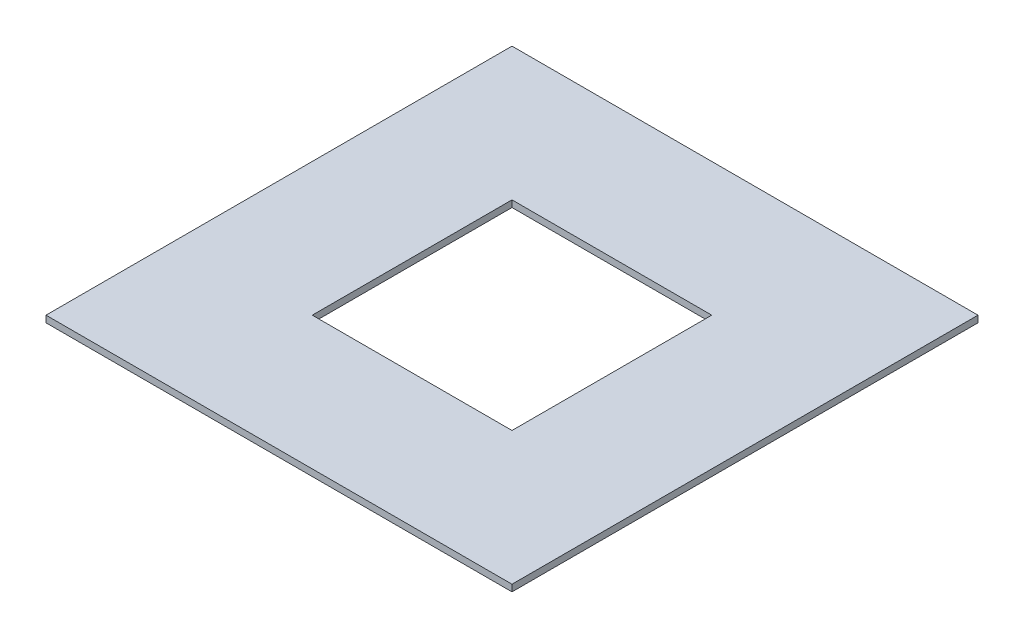
ISO-10303-21;
HEADER;
FILE_DESCRIPTION(('STEP AP214'),'2;1');
FILE_NAME('part.step','',(''),(''),'','','');
FILE_SCHEMA(('AUTOMOTIVE_DESIGN { 1 0 10303 214 1 1 1 1 }'));
ENDSEC;
DATA;
#1=APPLICATION_CONTEXT('core data for automotive mechanical design processes');
#2=APPLICATION_PROTOCOL_DEFINITION('international standard','automotive_design',2000,#1);
#3=PRODUCT_CONTEXT('',#1,'mechanical');
#4=PRODUCT('Part','Part','',(#3));
#5=PRODUCT_RELATED_PRODUCT_CATEGORY('part','',(#4));
#6=PRODUCT_DEFINITION_FORMATION('','',#4);
#7=PRODUCT_DEFINITION_CONTEXT('part definition',#1,'design');
#8=PRODUCT_DEFINITION('design','',#6,#7);
#9=PRODUCT_DEFINITION_SHAPE('','',#8);
#10=(LENGTH_UNIT() NAMED_UNIT(*) SI_UNIT(.MILLI.,.METRE.));
#11=(NAMED_UNIT(*) PLANE_ANGLE_UNIT() SI_UNIT($,.RADIAN.));
#12=(NAMED_UNIT(*) SI_UNIT($,.STERADIAN.) SOLID_ANGLE_UNIT());
#13=UNCERTAINTY_MEASURE_WITH_UNIT(LENGTH_MEASURE(1.E-05),#10,'distance_accuracy_value','');
#14=(GEOMETRIC_REPRESENTATION_CONTEXT(3) GLOBAL_UNCERTAINTY_ASSIGNED_CONTEXT((#13)) GLOBAL_UNIT_ASSIGNED_CONTEXT((#10,
#11,#12)) REPRESENTATION_CONTEXT('',''));
#15=CARTESIAN_POINT('',(0.,0.,0.));
#16=DIRECTION('',(0.,0.,1.));
#17=DIRECTION('',(1.,0.,0.));
#18=AXIS2_PLACEMENT_3D('',#15,#16,#17);
#19=CARTESIAN_POINT('',(-100.648126232742,-2.54,61.8968441814596));
#20=DIRECTION('',(0.,0.,1.));
#21=DIRECTION('',(1.,0.,0.));
#22=AXIS2_PLACEMENT_3D('',#19,#20,#21);
#23=PLANE('',#22);
#24=DIRECTION('',(1.,0.,0.));
#25=VECTOR('',#24,1.);
#26=CARTESIAN_POINT('',(-100.648126232742,0.,61.8968441814596));
#27=LINE('',#26,#25);
#28=CARTESIAN_POINT('',(-100.648126232742,0.,61.8968441814596));
#29=VERTEX_POINT('',#28);
#30=CARTESIAN_POINT('',(77.1518737672584,0.,61.8968441814596));
#31=VERTEX_POINT('',#30);
#32=EDGE_CURVE('E132',#29,#31,#27,.T.);
#33=ORIENTED_EDGE('',*,*,#32,.F.);
#34=DIRECTION('',(0.,1.,0.));
#35=VECTOR('',#34,1.);
#36=CARTESIAN_POINT('',(-100.648126232742,-2.54,61.8968441814596));
#37=LINE('',#36,#35);
#38=CARTESIAN_POINT('',(-100.648126232742,-2.54,61.8968441814596));
#39=VERTEX_POINT('',#38);
#40=EDGE_CURVE('E11',#39,#29,#37,.T.);
#41=ORIENTED_EDGE('',*,*,#40,.F.);
#42=DIRECTION('',(1.,0.,0.));
#43=VECTOR('',#42,1.);
#44=CARTESIAN_POINT('',(-100.648126232742,-2.54,61.8968441814596));
#45=LINE('',#44,#43);
#46=CARTESIAN_POINT('',(77.1518737672584,-2.54,61.8968441814596));
#47=VERTEX_POINT('',#46);
#48=EDGE_CURVE('E133',#39,#47,#45,.T.);
#49=ORIENTED_EDGE('',*,*,#48,.T.);
#50=DIRECTION('',(0.,1.,0.));
#51=VECTOR('',#50,1.);
#52=CARTESIAN_POINT('',(77.1518737672584,-2.54,61.8968441814596));
#53=LINE('',#52,#51);
#54=EDGE_CURVE('E35',#47,#31,#53,.T.);
#55=ORIENTED_EDGE('',*,*,#54,.T.);
#56=EDGE_LOOP('',(#33,#41,#49,#55));
#57=FACE_BOUND('',#56,.T.);
#58=ADVANCED_FACE('F32',(#57),#23,.T.);
#59=CARTESIAN_POINT('',(-100.648126232742,-2.54,-115.90315581854));
#60=DIRECTION('',(-1.,0.,0.));
#61=DIRECTION('',(0.,0.,1.));
#62=AXIS2_PLACEMENT_3D('',#59,#60,#61);
#63=PLANE('',#62);
#64=DIRECTION('',(0.,0.,1.));
#65=VECTOR('',#64,1.);
#66=CARTESIAN_POINT('',(-100.648126232742,0.,-115.90315581854));
#67=LINE('',#66,#65);
#68=CARTESIAN_POINT('',(-100.648126232742,0.,-115.90315581854));
#69=VERTEX_POINT('',#68);
#70=EDGE_CURVE('E137',#69,#29,#67,.T.);
#71=ORIENTED_EDGE('',*,*,#70,.F.);
#72=DIRECTION('',(0.,1.,0.));
#73=VECTOR('',#72,1.);
#74=CARTESIAN_POINT('',(-100.648126232742,-2.54,-115.90315581854));
#75=LINE('',#74,#73);
#76=CARTESIAN_POINT('',(-100.648126232742,-2.54,-115.90315581854));
#77=VERTEX_POINT('',#76);
#78=EDGE_CURVE('E40',#77,#69,#75,.T.);
#79=ORIENTED_EDGE('',*,*,#78,.F.);
#80=DIRECTION('',(0.,0.,1.));
#81=VECTOR('',#80,1.);
#82=CARTESIAN_POINT('',(-100.648126232742,-2.54,-115.90315581854));
#83=LINE('',#82,#81);
#84=EDGE_CURVE('E141',#77,#39,#83,.T.);
#85=ORIENTED_EDGE('',*,*,#84,.T.);
#86=ORIENTED_EDGE('',*,*,#40,.T.);
#87=EDGE_LOOP('',(#71,#79,#85,#86));
#88=FACE_BOUND('',#87,.T.);
#89=ADVANCED_FACE('F167',(#88),#63,.T.);
#90=CARTESIAN_POINT('',(-100.648126232742,-2.54,-115.90315581854));
#91=DIRECTION('',(0.,0.,1.));
#92=DIRECTION('',(1.,0.,0.));
#93=AXIS2_PLACEMENT_3D('',#90,#91,#92);
#94=PLANE('',#93);
#95=DIRECTION('',(1.,0.,0.));
#96=VECTOR('',#95,1.);
#97=CARTESIAN_POINT('',(-100.648126232742,0.,-115.90315581854));
#98=LINE('',#97,#96);
#99=CARTESIAN_POINT('',(77.1518737672584,0.,-115.90315581854));
#100=VERTEX_POINT('',#99);
#101=EDGE_CURVE('E149',#69,#100,#98,.T.);
#102=ORIENTED_EDGE('',*,*,#101,.T.);
#103=DIRECTION('',(0.,1.,0.));
#104=VECTOR('',#103,1.);
#105=CARTESIAN_POINT('',(77.1518737672584,-2.54,-115.90315581854));
#106=LINE('',#105,#104);
#107=CARTESIAN_POINT('',(77.1518737672584,-2.54,-115.90315581854));
#108=VERTEX_POINT('',#107);
#109=EDGE_CURVE('E153',#108,#100,#106,.T.);
#110=ORIENTED_EDGE('',*,*,#109,.F.);
#111=DIRECTION('',(1.,0.,0.));
#112=VECTOR('',#111,1.);
#113=CARTESIAN_POINT('',(-100.648126232742,-2.54,-115.90315581854));
#114=LINE('',#113,#112);
#115=EDGE_CURVE('E139',#77,#108,#114,.T.);
#116=ORIENTED_EDGE('',*,*,#115,.F.);
#117=ORIENTED_EDGE('',*,*,#78,.T.);
#118=EDGE_LOOP('',(#102,#110,#116,#117));
#119=FACE_BOUND('',#118,.T.);
#120=ADVANCED_FACE('F173',(#119),#94,.F.);
#121=CARTESIAN_POINT('',(77.1518737672584,-2.54,-115.90315581854));
#122=DIRECTION('',(-1.,0.,0.));
#123=DIRECTION('',(0.,0.,1.));
#124=AXIS2_PLACEMENT_3D('',#121,#122,#123);
#125=PLANE('',#124);
#126=DIRECTION('',(0.,0.,1.));
#127=VECTOR('',#126,1.);
#128=CARTESIAN_POINT('',(77.1518737672584,0.,-115.90315581854));
#129=LINE('',#128,#127);
#130=EDGE_CURVE('E146',#100,#31,#129,.T.);
#131=ORIENTED_EDGE('',*,*,#130,.T.);
#132=ORIENTED_EDGE('',*,*,#54,.F.);
#133=DIRECTION('',(0.,0.,1.));
#134=VECTOR('',#133,1.);
#135=CARTESIAN_POINT('',(77.1518737672584,-2.54,-115.90315581854));
#136=LINE('',#135,#134);
#137=EDGE_CURVE('E136',#108,#47,#136,.T.);
#138=ORIENTED_EDGE('',*,*,#137,.F.);
#139=ORIENTED_EDGE('',*,*,#109,.T.);
#140=EDGE_LOOP('',(#131,#132,#138,#139));
#141=FACE_BOUND('',#140,.T.);
#142=ADVANCED_FACE('F163',(#141),#125,.F.);
#143=CARTESIAN_POINT('',(0.,-2.54,0.));
#144=DIRECTION('',(0.,-1.,0.));
#145=DIRECTION('',(0.,0.,-1.));
#146=AXIS2_PLACEMENT_3D('',#143,#144,#145);
#147=PLANE('',#146);
#148=DIRECTION('',(-1.,0.,0.));
#149=VECTOR('',#148,1.);
#150=CARTESIAN_POINT('',(0.,-2.54,11.0968441814596));
#151=LINE('',#150,#149);
#152=CARTESIAN_POINT('',(26.3518737672584,-2.54,11.0968441814596));
#153=VERTEX_POINT('',#152);
#154=CARTESIAN_POINT('',(-49.8481262327416,-2.54,11.0968441814596));
#155=VERTEX_POINT('',#154);
#156=EDGE_CURVE('E130',#153,#155,#151,.T.);
#157=ORIENTED_EDGE('',*,*,#156,.F.);
#158=DIRECTION('',(0.,0.,-1.));
#159=VECTOR('',#158,1.);
#160=CARTESIAN_POINT('',(26.3518737672584,-2.54,0.));
#161=LINE('',#160,#159);
#162=CARTESIAN_POINT('',(26.3518737672584,-2.54,-65.1031558185404));
#163=VERTEX_POINT('',#162);
#164=EDGE_CURVE('E123',#153,#163,#161,.T.);
#165=ORIENTED_EDGE('',*,*,#164,.T.);
#166=DIRECTION('',(-1.,0.,0.));
#167=VECTOR('',#166,1.);
#168=CARTESIAN_POINT('',(0.,-2.54,-65.1031558185404));
#169=LINE('',#168,#167);
#170=CARTESIAN_POINT('',(-49.8481262327416,-2.54,-65.1031558185404));
#171=VERTEX_POINT('',#170);
#172=EDGE_CURVE('E103',#163,#171,#169,.T.);
#173=ORIENTED_EDGE('',*,*,#172,.T.);
#174=DIRECTION('',(0.,0.,-1.));
#175=VECTOR('',#174,1.);
#176=CARTESIAN_POINT('',(-49.8481262327416,-2.54,0.));
#177=LINE('',#176,#175);
#178=EDGE_CURVE('E128',#155,#171,#177,.T.);
#179=ORIENTED_EDGE('',*,*,#178,.F.);
#180=EDGE_LOOP('',(#157,#165,#173,#179));
#181=FACE_BOUND('',#180,.T.);
#182=ORIENTED_EDGE('',*,*,#48,.F.);
#183=ORIENTED_EDGE('',*,*,#84,.F.);
#184=ORIENTED_EDGE('',*,*,#115,.T.);
#185=ORIENTED_EDGE('',*,*,#137,.T.);
#186=EDGE_LOOP('',(#182,#183,#184,#185));
#187=FACE_BOUND('',#186,.T.);
#188=ADVANCED_FACE('F171',(#181,#187),#147,.T.);
#189=CARTESIAN_POINT('',(0.,0.,0.));
#190=DIRECTION('',(0.,-1.,0.));
#191=DIRECTION('',(0.,0.,-1.));
#192=AXIS2_PLACEMENT_3D('',#189,#190,#191);
#193=PLANE('',#192);
#194=DIRECTION('',(0.,0.,1.));
#195=VECTOR('',#194,1.);
#196=CARTESIAN_POINT('',(26.3518737672584,0.,-65.1031558185404));
#197=LINE('',#196,#195);
#198=CARTESIAN_POINT('',(26.3518737672584,0.,-65.1031558185404));
#199=VERTEX_POINT('',#198);
#200=CARTESIAN_POINT('',(26.3518737672584,0.,11.0968441814596));
#201=VERTEX_POINT('',#200);
#202=EDGE_CURVE('E109',#199,#201,#197,.T.);
#203=ORIENTED_EDGE('',*,*,#202,.T.);
#204=DIRECTION('',(1.,0.,0.));
#205=VECTOR('',#204,1.);
#206=CARTESIAN_POINT('',(-49.8481262327416,0.,11.0968441814596));
#207=LINE('',#206,#205);
#208=CARTESIAN_POINT('',(-49.8481262327416,0.,11.0968441814596));
#209=VERTEX_POINT('',#208);
#210=EDGE_CURVE('E56',#209,#201,#207,.T.);
#211=ORIENTED_EDGE('',*,*,#210,.F.);
#212=DIRECTION('',(0.,0.,1.));
#213=VECTOR('',#212,1.);
#214=CARTESIAN_POINT('',(-49.8481262327416,0.,-65.1031558185404));
#215=LINE('',#214,#213);
#216=CARTESIAN_POINT('',(-49.8481262327416,0.,-65.1031558185404));
#217=VERTEX_POINT('',#216);
#218=EDGE_CURVE('E116',#217,#209,#215,.T.);
#219=ORIENTED_EDGE('',*,*,#218,.F.);
#220=DIRECTION('',(1.,0.,0.));
#221=VECTOR('',#220,1.);
#222=CARTESIAN_POINT('',(-49.8481262327416,0.,-65.1031558185404));
#223=LINE('',#222,#221);
#224=EDGE_CURVE('E100',#217,#199,#223,.T.);
#225=ORIENTED_EDGE('',*,*,#224,.T.);
#226=EDGE_LOOP('',(#203,#211,#219,#225));
#227=FACE_BOUND('',#226,.T.);
#228=ORIENTED_EDGE('',*,*,#32,.T.);
#229=ORIENTED_EDGE('',*,*,#130,.F.);
#230=ORIENTED_EDGE('',*,*,#101,.F.);
#231=ORIENTED_EDGE('',*,*,#70,.T.);
#232=EDGE_LOOP('',(#228,#229,#230,#231));
#233=FACE_BOUND('',#232,.T.);
#234=ADVANCED_FACE('F113',(#227,#233),#193,.F.);
#235=CARTESIAN_POINT('',(-49.8481262327416,-84.074,11.0968441814596));
#236=DIRECTION('',(0.,0.,1.));
#237=DIRECTION('',(1.,0.,0.));
#238=AXIS2_PLACEMENT_3D('',#235,#236,#237);
#239=PLANE('',#238);
#240=ORIENTED_EDGE('',*,*,#156,.T.);
#241=DIRECTION('',(0.,1.,0.));
#242=VECTOR('',#241,1.);
#243=CARTESIAN_POINT('',(-49.8481262327416,-84.074,11.0968441814596));
#244=LINE('',#243,#242);
#245=EDGE_CURVE('E121',#155,#209,#244,.T.);
#246=ORIENTED_EDGE('',*,*,#245,.T.);
#247=ORIENTED_EDGE('',*,*,#210,.T.);
#248=DIRECTION('',(0.,1.,0.));
#249=VECTOR('',#248,1.);
#250=CARTESIAN_POINT('',(26.3518737672584,-84.074,11.0968441814596));
#251=LINE('',#250,#249);
#252=EDGE_CURVE('E106',#153,#201,#251,.T.);
#253=ORIENTED_EDGE('',*,*,#252,.F.);
#254=EDGE_LOOP('',(#240,#246,#247,#253));
#255=FACE_BOUND('',#254,.T.);
#256=ADVANCED_FACE('F216',(#255),#239,.F.);
#257=CARTESIAN_POINT('',(-49.8481262327416,-84.074,-65.1031558185404));
#258=DIRECTION('',(-1.,0.,0.));
#259=DIRECTION('',(0.,0.,1.));
#260=AXIS2_PLACEMENT_3D('',#257,#258,#259);
#261=PLANE('',#260);
#262=ORIENTED_EDGE('',*,*,#178,.T.);
#263=DIRECTION('',(0.,1.,0.));
#264=VECTOR('',#263,1.);
#265=CARTESIAN_POINT('',(-49.8481262327416,-84.074,-65.1031558185404));
#266=LINE('',#265,#264);
#267=EDGE_CURVE('E105',#171,#217,#266,.T.);
#268=ORIENTED_EDGE('',*,*,#267,.T.);
#269=ORIENTED_EDGE('',*,*,#218,.T.);
#270=ORIENTED_EDGE('',*,*,#245,.F.);
#271=EDGE_LOOP('',(#262,#268,#269,#270));
#272=FACE_BOUND('',#271,.T.);
#273=ADVANCED_FACE('F225',(#272),#261,.F.);
#274=CARTESIAN_POINT('',(-49.8481262327416,-84.074,-65.1031558185404));
#275=DIRECTION('',(0.,0.,1.));
#276=DIRECTION('',(1.,0.,0.));
#277=AXIS2_PLACEMENT_3D('',#274,#275,#276);
#278=PLANE('',#277);
#279=DIRECTION('',(0.,1.,0.));
#280=VECTOR('',#279,1.);
#281=CARTESIAN_POINT('',(26.3518737672584,-84.074,-65.1031558185404));
#282=LINE('',#281,#280);
#283=EDGE_CURVE('E48',#163,#199,#282,.T.);
#284=ORIENTED_EDGE('',*,*,#283,.T.);
#285=ORIENTED_EDGE('',*,*,#224,.F.);
#286=ORIENTED_EDGE('',*,*,#267,.F.);
#287=ORIENTED_EDGE('',*,*,#172,.F.);
#288=EDGE_LOOP('',(#284,#285,#286,#287));
#289=FACE_BOUND('',#288,.T.);
#290=ADVANCED_FACE('F97',(#289),#278,.T.);
#291=CARTESIAN_POINT('',(26.3518737672584,-84.074,-65.1031558185404));
#292=DIRECTION('',(-1.,0.,0.));
#293=DIRECTION('',(0.,0.,1.));
#294=AXIS2_PLACEMENT_3D('',#291,#292,#293);
#295=PLANE('',#294);
#296=ORIENTED_EDGE('',*,*,#252,.T.);
#297=ORIENTED_EDGE('',*,*,#202,.F.);
#298=ORIENTED_EDGE('',*,*,#283,.F.);
#299=ORIENTED_EDGE('',*,*,#164,.F.);
#300=EDGE_LOOP('',(#296,#297,#298,#299));
#301=FACE_BOUND('',#300,.T.);
#302=ADVANCED_FACE('F110',(#301),#295,.T.);
#303=CLOSED_SHELL('',(#58,#89,#120,#142,#188,#234,#256,#273,#290,#302));
#304=MANIFOLD_SOLID_BREP('B2',#303);
#305=ADVANCED_BREP_SHAPE_REPRESENTATION('',(#18,#304),#14);
#306=SHAPE_DEFINITION_REPRESENTATION(#9,#305);
ENDSEC;
END-ISO-10303-21;
